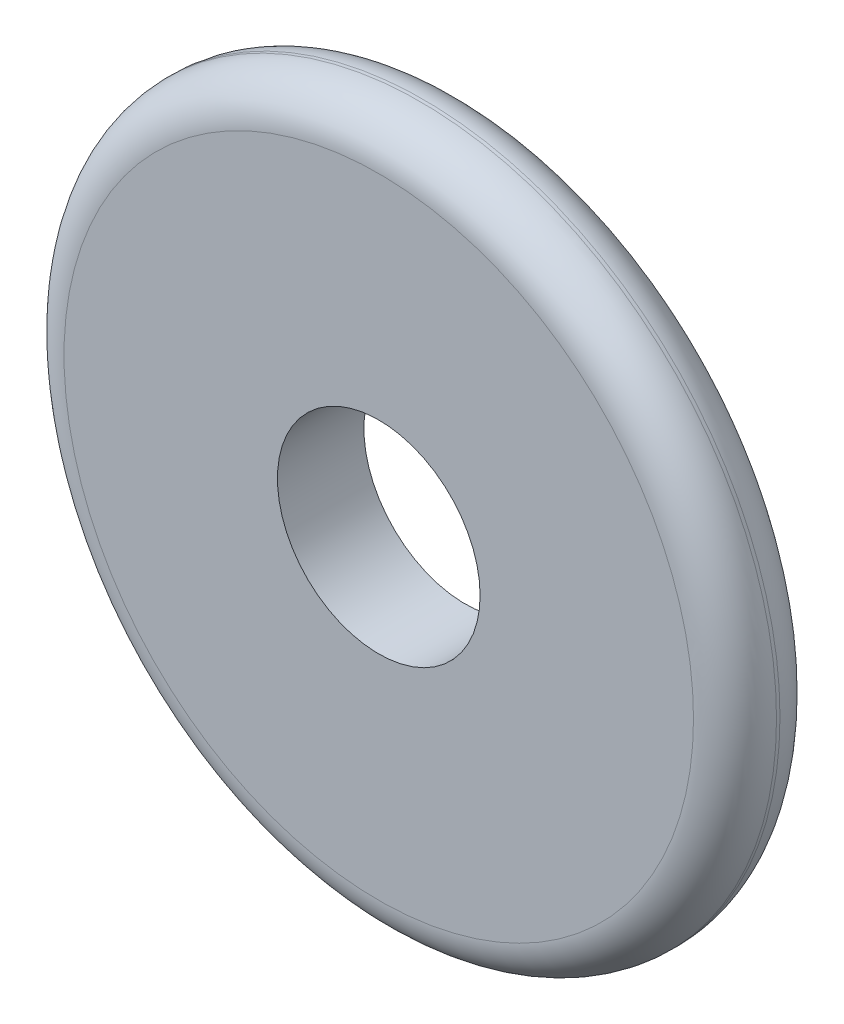
ISO-10303-21;
HEADER;
FILE_DESCRIPTION(('STEP AP214'),'2;1');
FILE_NAME('part.step','',(''),(''),'','','');
FILE_SCHEMA(('AUTOMOTIVE_DESIGN { 1 0 10303 214 1 1 1 1 }'));
ENDSEC;
DATA;
#1=APPLICATION_CONTEXT('core data for automotive mechanical design processes');
#2=APPLICATION_PROTOCOL_DEFINITION('international standard','automotive_design',2000,#1);
#3=PRODUCT_CONTEXT('',#1,'mechanical');
#4=PRODUCT('Part','Part','',(#3));
#5=PRODUCT_RELATED_PRODUCT_CATEGORY('part','',(#4));
#6=PRODUCT_DEFINITION_FORMATION('','',#4);
#7=PRODUCT_DEFINITION_CONTEXT('part definition',#1,'design');
#8=PRODUCT_DEFINITION('design','',#6,#7);
#9=PRODUCT_DEFINITION_SHAPE('','',#8);
#10=(LENGTH_UNIT() NAMED_UNIT(*) SI_UNIT(.MILLI.,.METRE.));
#11=(NAMED_UNIT(*) PLANE_ANGLE_UNIT() SI_UNIT($,.RADIAN.));
#12=(NAMED_UNIT(*) SI_UNIT($,.STERADIAN.) SOLID_ANGLE_UNIT());
#13=UNCERTAINTY_MEASURE_WITH_UNIT(LENGTH_MEASURE(1.E-05),#10,'distance_accuracy_value','');
#14=(GEOMETRIC_REPRESENTATION_CONTEXT(3) GLOBAL_UNCERTAINTY_ASSIGNED_CONTEXT((#13)) GLOBAL_UNIT_ASSIGNED_CONTEXT((#10,
#11,#12)) REPRESENTATION_CONTEXT('',''));
#15=CARTESIAN_POINT('',(0.,0.,0.));
#16=DIRECTION('',(0.,0.,1.));
#17=DIRECTION('',(1.,0.,0.));
#18=AXIS2_PLACEMENT_3D('',#15,#16,#17);
#19=CARTESIAN_POINT('',(0.,0.,12.5));
#20=DIRECTION('',(0.,0.,1.));
#21=DIRECTION('',(1.,0.,0.));
#22=AXIS2_PLACEMENT_3D('',#19,#20,#21);
#23=PLANE('',#22);
#24=CARTESIAN_POINT('',(0.,0.,12.5));
#25=DIRECTION('',(0.,0.,1.));
#26=DIRECTION('',(1.,0.,0.));
#27=AXIS2_PLACEMENT_3D('',#24,#25,#26);
#28=CIRCLE('',#27,45.5);
#29=CARTESIAN_POINT('',(45.5,0.,12.5));
#30=VERTEX_POINT('',#29);
#31=EDGE_CURVE('E10',#30,#30,#28,.T.);
#32=ORIENTED_EDGE('',*,*,#31,.T.);
#33=EDGE_LOOP('',(#32));
#34=FACE_BOUND('',#33,.T.);
#35=CARTESIAN_POINT('',(0.,0.,12.5));
#36=DIRECTION('',(0.,0.,1.));
#37=DIRECTION('',(1.,0.,0.));
#38=AXIS2_PLACEMENT_3D('',#35,#36,#37);
#39=CIRCLE('',#38,14.65);
#40=CARTESIAN_POINT('',(14.65,0.,12.5));
#41=VERTEX_POINT('',#40);
#42=EDGE_CURVE('E51',#41,#41,#39,.T.);
#43=ORIENTED_EDGE('',*,*,#42,.F.);
#44=EDGE_LOOP('',(#43));
#45=FACE_BOUND('',#44,.T.);
#46=ADVANCED_FACE('F31',(#34,#45),#23,.T.);
#47=CARTESIAN_POINT('',(0.,0.,0.));
#48=DIRECTION('',(0.,0.,1.));
#49=DIRECTION('',(1.,0.,0.));
#50=AXIS2_PLACEMENT_3D('',#47,#48,#49);
#51=PLANE('',#50);
#52=CARTESIAN_POINT('',(0.,0.,0.));
#53=DIRECTION('',(0.,0.,1.));
#54=DIRECTION('',(1.,0.,0.));
#55=AXIS2_PLACEMENT_3D('',#52,#53,#54);
#56=CIRCLE('',#55,45.5);
#57=CARTESIAN_POINT('',(45.5,0.,0.));
#58=VERTEX_POINT('',#57);
#59=EDGE_CURVE('E38',#58,#58,#56,.F.);
#60=ORIENTED_EDGE('',*,*,#59,.T.);
#61=EDGE_LOOP('',(#60));
#62=FACE_BOUND('',#61,.T.);
#63=CARTESIAN_POINT('',(0.,0.,0.));
#64=DIRECTION('',(0.,0.,1.));
#65=DIRECTION('',(1.,0.,0.));
#66=AXIS2_PLACEMENT_3D('',#63,#64,#65);
#67=CIRCLE('',#66,14.65);
#68=CARTESIAN_POINT('',(14.65,0.,0.));
#69=VERTEX_POINT('',#68);
#70=EDGE_CURVE('E52',#69,#69,#67,.T.);
#71=ORIENTED_EDGE('',*,*,#70,.T.);
#72=EDGE_LOOP('',(#71));
#73=FACE_BOUND('',#72,.T.);
#74=ADVANCED_FACE('F62',(#62,#73),#51,.F.);
#75=CARTESIAN_POINT('',(0.,0.,12.5));
#76=DIRECTION('',(0.,0.,-1.));
#77=DIRECTION('',(-1.,0.,0.));
#78=AXIS2_PLACEMENT_3D('',#75,#76,#77);
#79=CYLINDRICAL_SURFACE('',#78,51.5);
#80=CARTESIAN_POINT('',(0.,0.,6.));
#81=DIRECTION('',(0.,0.,1.));
#82=DIRECTION('',(1.,0.,0.));
#83=AXIS2_PLACEMENT_3D('',#80,#81,#82);
#84=CIRCLE('',#83,51.5);
#85=CARTESIAN_POINT('',(51.5,0.,6.));
#86=VERTEX_POINT('',#85);
#87=EDGE_CURVE('E42',#86,#86,#84,.T.);
#88=ORIENTED_EDGE('',*,*,#87,.T.);
#89=EDGE_LOOP('',(#88));
#90=FACE_BOUND('',#89,.T.);
#91=CARTESIAN_POINT('',(0.,0.,6.5));
#92=DIRECTION('',(0.,0.,1.));
#93=DIRECTION('',(1.,0.,0.));
#94=AXIS2_PLACEMENT_3D('',#91,#92,#93);
#95=CIRCLE('',#94,51.5);
#96=CARTESIAN_POINT('',(51.5,0.,6.5));
#97=VERTEX_POINT('',#96);
#98=EDGE_CURVE('E46',#97,#97,#95,.F.);
#99=ORIENTED_EDGE('',*,*,#98,.T.);
#100=EDGE_LOOP('',(#99));
#101=FACE_BOUND('',#100,.T.);
#102=ADVANCED_FACE('F67',(#90,#101),#79,.T.);
#103=CARTESIAN_POINT('',(0.,0.,12.5));
#104=DIRECTION('',(0.,0.,-1.));
#105=DIRECTION('',(-1.,0.,0.));
#106=AXIS2_PLACEMENT_3D('',#103,#104,#105);
#107=CYLINDRICAL_SURFACE('',#106,14.65);
#108=ORIENTED_EDGE('',*,*,#42,.T.);
#109=EDGE_LOOP('',(#108));
#110=FACE_BOUND('',#109,.T.);
#111=ORIENTED_EDGE('',*,*,#70,.F.);
#112=EDGE_LOOP('',(#111));
#113=FACE_BOUND('',#112,.T.);
#114=ADVANCED_FACE('F58',(#110,#113),#107,.F.);
#115=CARTESIAN_POINT('',(0.,0.,6.));
#116=DIRECTION('',(0.,0.,1.));
#117=DIRECTION('',(1.,0.,0.));
#118=AXIS2_PLACEMENT_3D('',#115,#116,#117);
#119=TOROIDAL_SURFACE('',#118,45.5,6.);
#120=ORIENTED_EDGE('',*,*,#59,.F.);
#121=EDGE_LOOP('',(#120));
#122=FACE_BOUND('',#121,.T.);
#123=ORIENTED_EDGE('',*,*,#87,.F.);
#124=EDGE_LOOP('',(#123));
#125=FACE_BOUND('',#124,.T.);
#126=ADVANCED_FACE('F73',(#122,#125),#119,.T.);
#127=CARTESIAN_POINT('',(0.,0.,6.5));
#128=DIRECTION('',(0.,0.,1.));
#129=DIRECTION('',(1.,0.,0.));
#130=AXIS2_PLACEMENT_3D('',#127,#128,#129);
#131=TOROIDAL_SURFACE('',#130,45.5,6.);
#132=ORIENTED_EDGE('',*,*,#98,.F.);
#133=EDGE_LOOP('',(#132));
#134=FACE_BOUND('',#133,.T.);
#135=ORIENTED_EDGE('',*,*,#31,.F.);
#136=EDGE_LOOP('',(#135));
#137=FACE_BOUND('',#136,.T.);
#138=ADVANCED_FACE('F33',(#134,#137),#131,.T.);
#139=CLOSED_SHELL('',(#46,#74,#102,#114,#126,#138));
#140=MANIFOLD_SOLID_BREP('B2',#139);
#141=ADVANCED_BREP_SHAPE_REPRESENTATION('',(#18,#140),#14);
#142=SHAPE_DEFINITION_REPRESENTATION(#9,#141);
ENDSEC;
END-ISO-10303-21;
